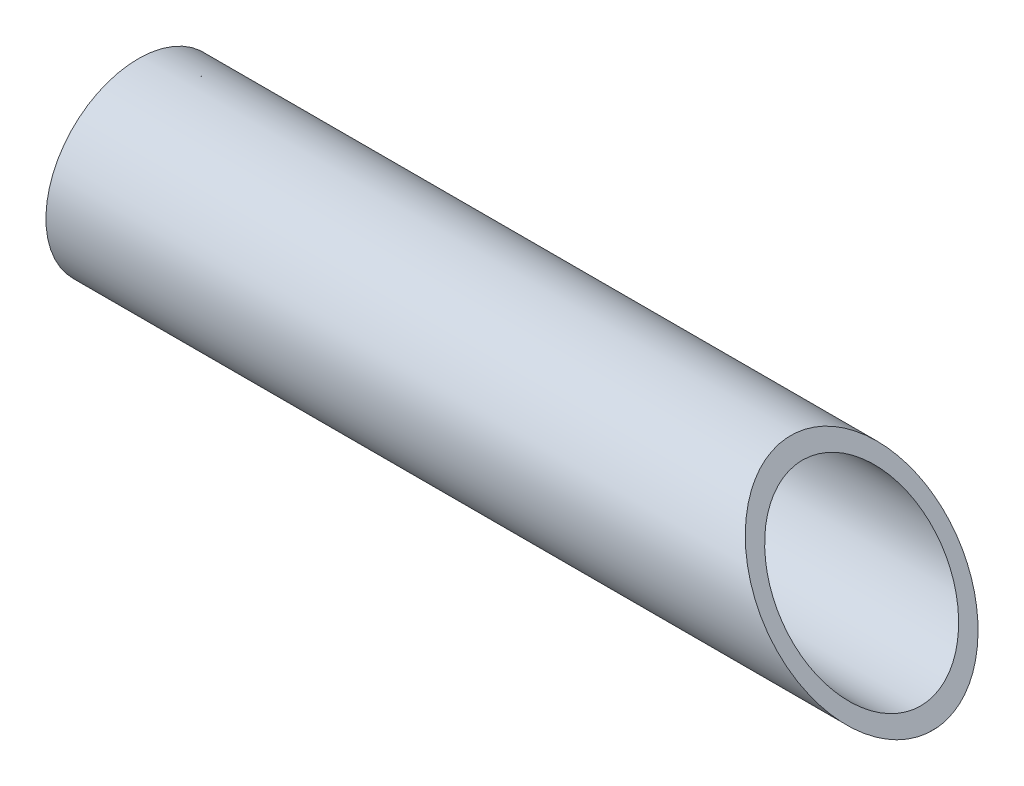
ISO-10303-21;
HEADER;
FILE_DESCRIPTION(('STEP AP214'),'2;1');
FILE_NAME('part.step','',(''),(''),'','','');
FILE_SCHEMA(('AUTOMOTIVE_DESIGN { 1 0 10303 214 1 1 1 1 }'));
ENDSEC;
DATA;
#1=APPLICATION_CONTEXT('core data for automotive mechanical design processes');
#2=APPLICATION_PROTOCOL_DEFINITION('international standard','automotive_design',2000,#1);
#3=PRODUCT_CONTEXT('',#1,'mechanical');
#4=PRODUCT('Part','Part','',(#3));
#5=PRODUCT_RELATED_PRODUCT_CATEGORY('part','',(#4));
#6=PRODUCT_DEFINITION_FORMATION('','',#4);
#7=PRODUCT_DEFINITION_CONTEXT('part definition',#1,'design');
#8=PRODUCT_DEFINITION('design','',#6,#7);
#9=PRODUCT_DEFINITION_SHAPE('','',#8);
#10=(LENGTH_UNIT() NAMED_UNIT(*) SI_UNIT(.MILLI.,.METRE.));
#11=(NAMED_UNIT(*) PLANE_ANGLE_UNIT() SI_UNIT($,.RADIAN.));
#12=(NAMED_UNIT(*) SI_UNIT($,.STERADIAN.) SOLID_ANGLE_UNIT());
#13=UNCERTAINTY_MEASURE_WITH_UNIT(LENGTH_MEASURE(1.E-05),#10,'distance_accuracy_value','');
#14=(GEOMETRIC_REPRESENTATION_CONTEXT(3) GLOBAL_UNCERTAINTY_ASSIGNED_CONTEXT((#13)) GLOBAL_UNIT_ASSIGNED_CONTEXT((#10,
#11,#12)) REPRESENTATION_CONTEXT('',''));
#15=CARTESIAN_POINT('',(0.,0.,0.));
#16=DIRECTION('',(0.,0.,1.));
#17=DIRECTION('',(1.,0.,0.));
#18=AXIS2_PLACEMENT_3D('',#15,#16,#17);
#19=CARTESIAN_POINT('',(258.,0.,0.));
#20=DIRECTION('',(1.,0.,0.));
#21=DIRECTION('',(0.,0.,-1.));
#22=AXIS2_PLACEMENT_3D('',#19,#20,#21);
#23=PLANE('',#22);
#24=DIRECTION('',(0.,0.,-1.));
#25=VECTOR('',#24,1.);
#26=CARTESIAN_POINT('',(258.,-29.9483671506957,0.));
#27=LINE('',#26,#25);
#28=CARTESIAN_POINT('',(258.,-29.9483671506957,1.75934789258106));
#29=VERTEX_POINT('',#28);
#30=CARTESIAN_POINT('',(258.,-29.9483671506957,-1.75934789258106));
#31=VERTEX_POINT('',#30);
#32=EDGE_CURVE('E56',#29,#31,#27,.T.);
#33=ORIENTED_EDGE('',*,*,#32,.F.);
#34=CARTESIAN_POINT('',(258.,0.,0.));
#35=DIRECTION('',(1.,0.,0.));
#36=DIRECTION('',(0.,0.,-1.));
#37=AXIS2_PLACEMENT_3D('',#34,#35,#36);
#38=CIRCLE('',#37,30.);
#39=EDGE_CURVE('E11',#29,#31,#38,.T.);
#40=ORIENTED_EDGE('',*,*,#39,.T.);
#41=EDGE_LOOP('',(#33,#40));
#42=FACE_BOUND('',#41,.T.);
#43=ADVANCED_FACE('F34',(#42),#23,.T.);
#44=CARTESIAN_POINT('',(0.,0.,0.));
#45=DIRECTION('',(1.,0.,0.));
#46=DIRECTION('',(0.,0.,-1.));
#47=AXIS2_PLACEMENT_3D('',#44,#45,#46);
#48=PLANE('',#47);
#49=CARTESIAN_POINT('',(0.,0.,0.));
#50=DIRECTION('',(1.,0.,0.));
#51=DIRECTION('',(0.,0.,-1.));
#52=AXIS2_PLACEMENT_3D('',#49,#50,#51);
#53=CIRCLE('',#52,30.);
#54=CARTESIAN_POINT('',(0.,0.,-30.));
#55=VERTEX_POINT('',#54);
#56=EDGE_CURVE('E43',#55,#55,#53,.T.);
#57=ORIENTED_EDGE('',*,*,#56,.F.);
#58=EDGE_LOOP('',(#57));
#59=FACE_BOUND('',#58,.T.);
#60=CARTESIAN_POINT('',(0.,0.,0.));
#61=DIRECTION('',(1.,0.,0.));
#62=DIRECTION('',(0.,0.,-1.));
#63=AXIS2_PLACEMENT_3D('',#60,#61,#62);
#64=CIRCLE('',#63,25.);
#65=CARTESIAN_POINT('',(0.,0.,-25.));
#66=VERTEX_POINT('',#65);
#67=EDGE_CURVE('E59',#66,#66,#64,.T.);
#68=ORIENTED_EDGE('',*,*,#67,.T.);
#69=EDGE_LOOP('',(#68));
#70=FACE_BOUND('',#69,.T.);
#71=ADVANCED_FACE('F64',(#59,#70),#48,.F.);
#72=CARTESIAN_POINT('',(258.,0.,0.));
#73=DIRECTION('',(-1.,0.,0.));
#74=DIRECTION('',(0.,0.,1.));
#75=AXIS2_PLACEMENT_3D('',#72,#73,#74);
#76=CYLINDRICAL_SURFACE('',#75,30.);
#77=CARTESIAN_POINT('',(235.019809639369,0.,0.));
#78=DIRECTION('',(-0.793353340291236,-0.608761429008719,0.));
#79=DIRECTION('',(-0.608761429008719,0.793353340291236,0.));
#80=AXIS2_PLACEMENT_3D('',#77,#78,#79);
#81=ELLIPSE('',#80,37.8141724203079,30.);
#82=EDGE_CURVE('E50',#29,#31,#81,.T.);
#83=ORIENTED_EDGE('',*,*,#82,.T.);
#84=ORIENTED_EDGE('',*,*,#39,.F.);
#85=EDGE_LOOP('',(#83,#84));
#86=FACE_BOUND('',#85,.T.);
#87=ORIENTED_EDGE('',*,*,#56,.T.);
#88=EDGE_LOOP('',(#87));
#89=FACE_BOUND('',#88,.T.);
#90=ADVANCED_FACE('F36',(#86,#89),#76,.T.);
#91=CARTESIAN_POINT('',(258.,0.,0.));
#92=DIRECTION('',(-1.,0.,0.));
#93=DIRECTION('',(0.,0.,1.));
#94=AXIS2_PLACEMENT_3D('',#91,#92,#93);
#95=CYLINDRICAL_SURFACE('',#94,25.);
#96=CARTESIAN_POINT('',(235.019809639369,0.,0.));
#97=DIRECTION('',(-0.793353340291236,-0.608761429008719,0.));
#98=DIRECTION('',(-0.608761429008719,0.793353340291236,0.));
#99=AXIS2_PLACEMENT_3D('',#96,#97,#98);
#100=ELLIPSE('',#99,31.5118103502566,25.);
#101=CARTESIAN_POINT('',(215.836634939895,25.,0.));
#102=VERTEX_POINT('',#101);
#103=EDGE_CURVE('E38',#102,#102,#100,.T.);
#104=ORIENTED_EDGE('',*,*,#103,.F.);
#105=EDGE_LOOP('',(#104));
#106=FACE_BOUND('',#105,.T.);
#107=ORIENTED_EDGE('',*,*,#67,.F.);
#108=EDGE_LOOP('',(#107));
#109=FACE_BOUND('',#108,.T.);
#110=ADVANCED_FACE('F63',(#106,#109),#95,.F.);
#111=CARTESIAN_POINT('',(212.,30.,-129.));
#112=DIRECTION('',(-0.793353340291236,-0.608761429008719,0.));
#113=DIRECTION('',(0.608761429008719,-0.793353340291236,0.));
#114=AXIS2_PLACEMENT_3D('',#111,#112,#113);
#115=PLANE('',#114);
#116=ORIENTED_EDGE('',*,*,#32,.T.);
#117=ORIENTED_EDGE('',*,*,#82,.F.);
#118=EDGE_LOOP('',(#116,#117));
#119=FACE_BOUND('',#118,.T.);
#120=ORIENTED_EDGE('',*,*,#103,.T.);
#121=EDGE_LOOP('',(#120));
#122=FACE_BOUND('',#121,.T.);
#123=ADVANCED_FACE('F54',(#119,#122),#115,.F.);
#124=CLOSED_SHELL('',(#43,#71,#90,#110,#123));
#125=MANIFOLD_SOLID_BREP('B2',#124);
#126=ADVANCED_BREP_SHAPE_REPRESENTATION('',(#18,#125),#14);
#127=SHAPE_DEFINITION_REPRESENTATION(#9,#126);
ENDSEC;
END-ISO-10303-21;
